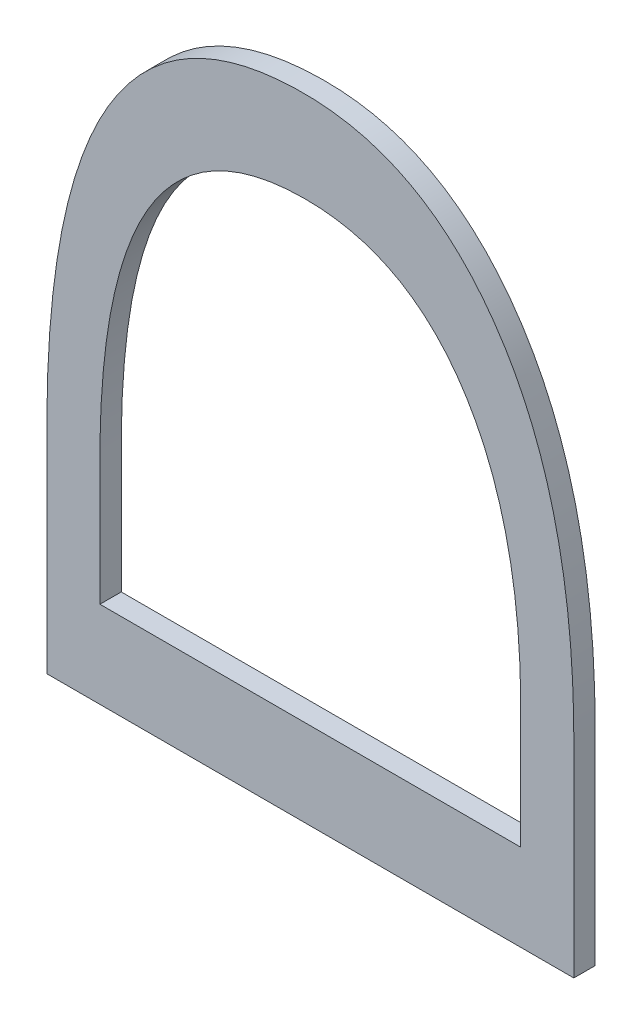
ISO-10303-21;
HEADER;
FILE_DESCRIPTION(('STEP AP214'),'2;1');
FILE_NAME('part.step','',(''),(''),'','','');
FILE_SCHEMA(('AUTOMOTIVE_DESIGN { 1 0 10303 214 1 1 1 1 }'));
ENDSEC;
DATA;
#1=APPLICATION_CONTEXT('core data for automotive mechanical design processes');
#2=APPLICATION_PROTOCOL_DEFINITION('international standard','automotive_design',2000,#1);
#3=PRODUCT_CONTEXT('',#1,'mechanical');
#4=PRODUCT('Part','Part','',(#3));
#5=PRODUCT_RELATED_PRODUCT_CATEGORY('part','',(#4));
#6=PRODUCT_DEFINITION_FORMATION('','',#4);
#7=PRODUCT_DEFINITION_CONTEXT('part definition',#1,'design');
#8=PRODUCT_DEFINITION('design','',#6,#7);
#9=PRODUCT_DEFINITION_SHAPE('','',#8);
#10=(LENGTH_UNIT() NAMED_UNIT(*) SI_UNIT(.MILLI.,.METRE.));
#11=(NAMED_UNIT(*) PLANE_ANGLE_UNIT() SI_UNIT($,.RADIAN.));
#12=(NAMED_UNIT(*) SI_UNIT($,.STERADIAN.) SOLID_ANGLE_UNIT());
#13=UNCERTAINTY_MEASURE_WITH_UNIT(LENGTH_MEASURE(1.E-05),#10,'distance_accuracy_value','');
#14=(GEOMETRIC_REPRESENTATION_CONTEXT(3) GLOBAL_UNCERTAINTY_ASSIGNED_CONTEXT((#13)) GLOBAL_UNIT_ASSIGNED_CONTEXT((#10,
#11,#12)) REPRESENTATION_CONTEXT('',''));
#15=CARTESIAN_POINT('',(0.,0.,0.));
#16=DIRECTION('',(0.,0.,1.));
#17=DIRECTION('',(1.,0.,0.));
#18=AXIS2_PLACEMENT_3D('',#15,#16,#17);
#19=CARTESIAN_POINT('',(-8.95983005625009,-22.7704584365744,333.160489148867));
#20=DIRECTION('',(0.,0.,1.));
#21=DIRECTION('',(1.,0.,0.));
#22=AXIS2_PLACEMENT_3D('',#19,#20,#21);
#23=PLANE('',#22);
#24=CARTESIAN_POINT('',(-13.8325482804087,-44.3320507494548,333.160489148867));
#25=CARTESIAN_POINT('',(-13.8325482804087,-43.3263791281688,333.160489148867));
#26=CARTESIAN_POINT('',(-13.8325482804087,-42.3207075068828,333.160489148867));
#27=CARTESIAN_POINT('',(-13.8325482804087,-37.4024948968582,333.160489148867));
#28=CARTESIAN_POINT('',(-12.6273384456497,-35.4462240517384,333.160489148867));
#29=CARTESIAN_POINT('',(-9.061195241034,-35.4462240517384,333.160489148867));
#30=CARTESIAN_POINT('',(-8.1385310894113,-35.9730048119212,333.160489148867));
#31=CARTESIAN_POINT('',(-6.7593248729568,-38.0801261686606,333.160489148867));
#32=CARTESIAN_POINT('',(-6.41452319026449,-39.5479279632996,333.160489148867));
#33=CARTESIAN_POINT('',(-6.41452319026449,-42.3973301965701,333.160489148867));
#34=CARTESIAN_POINT('',(-6.41452319026449,-43.3646904730125,333.160489148867));
#35=CARTESIAN_POINT('',(-6.41452319026449,-44.3320507494548,333.160489148867));
#36=(BOUNDED_CURVE() B_SPLINE_CURVE(3,(#24,#25,#26,#27,#28,#29,#30,#31,#32,#33,#34,#35),
.UNSPECIFIED.,.F.,.F.) B_SPLINE_CURVE_WITH_KNOTS((4,2,2,2,2,4),(0.,0.104384105417481,
0.510487929344108,0.705202651644714,0.899917519166078,1.),
.UNSPECIFIED.) CURVE() GEOMETRIC_REPRESENTATION_ITEM() RATIONAL_B_SPLINE_CURVE((1.,1.,1.,1.,1.,
1.,1.,1.,1.,1.,1.,1.)) REPRESENTATION_ITEM(''));
#37=CARTESIAN_POINT('',(-13.8325482804087,-44.3320507494548,333.160489148867));
#38=VERTEX_POINT('',#37);
#39=CARTESIAN_POINT('',(-6.41452319026449,-44.3320507494548,333.160489148867));
#40=VERTEX_POINT('',#39);
#41=EDGE_CURVE('E11',#38,#40,#36,.T.);
#42=ORIENTED_EDGE('',*,*,#41,.T.);
#43=DIRECTION('',(-1.,0.,0.));
#44=VECTOR('',#43,1.);
#45=CARTESIAN_POINT('',(2.66453525910038E-13,-44.3320507494548,333.160489148867));
#46=LINE('',#45,#44);
#47=EDGE_CURVE('E120',#40,#38,#46,.T.);
#48=ORIENTED_EDGE('',*,*,#47,.T.);
#49=EDGE_LOOP('',(#42,#48));
#50=FACE_BOUND('',#49,.T.);
#51=CARTESIAN_POINT('',(-7.16159350276449,-43.1108781232529,333.160489148867));
#52=CARTESIAN_POINT('',(-7.16159350276449,-42.5457864766182,333.160489148867));
#53=CARTESIAN_POINT('',(-7.16159350276449,-41.9806948299836,333.160489148867));
#54=CARTESIAN_POINT('',(-7.16159350276449,-39.9358292951279,333.160489148867));
#55=CARTESIAN_POINT('',(-7.42657987323588,-38.7840963618851,333.160489148867));
#56=CARTESIAN_POINT('',(-8.48652576988016,-37.1367102664495,333.160489148867));
#57=CARTESIAN_POINT('',(-9.23199965358236,-36.7248636250557,333.160489148867));
#58=CARTESIAN_POINT('',(-12.1213101749282,-36.7248636250557,333.160489148867));
#59=CARTESIAN_POINT('',(-13.0854779679087,-38.264499103589,333.160489148867));
#60=CARTESIAN_POINT('',(-13.0854779679087,-41.932805613854,333.160489148867));
#61=CARTESIAN_POINT('',(-13.0854779679087,-42.5218418685534,333.160489148867));
#62=CARTESIAN_POINT('',(-13.0854779679087,-43.1108781232529,333.160489148867));
#63=(BOUNDED_CURVE() B_SPLINE_CURVE(3,(#51,#52,#53,#54,#55,#56,#57,#58,#59,#60,#61,#62),
.UNSPECIFIED.,.F.,.F.) B_SPLINE_CURVE_WITH_KNOTS((4,2,2,2,2,4),(0.,0.0800183044780574,
0.289557762814667,0.499097055222359,0.919567791368009,1.),
.UNSPECIFIED.) CURVE() GEOMETRIC_REPRESENTATION_ITEM() RATIONAL_B_SPLINE_CURVE((1.,1.,1.,1.,1.,
1.,1.,1.,1.,1.,1.,1.)) REPRESENTATION_ITEM(''));
#64=CARTESIAN_POINT('',(-7.16159350276449,-43.1108781232529,333.160489148867));
#65=VERTEX_POINT('',#64);
#66=CARTESIAN_POINT('',(-13.0854779679087,-43.1108781232529,333.160489148867));
#67=VERTEX_POINT('',#66);
#68=EDGE_CURVE('E89',#65,#67,#63,.T.);
#69=ORIENTED_EDGE('',*,*,#68,.T.);
#70=DIRECTION('',(1.,0.,0.));
#71=VECTOR('',#70,1.);
#72=CARTESIAN_POINT('',(2.66453525910038E-13,-43.1108781232529,333.160489148867));
#73=LINE('',#72,#71);
#74=EDGE_CURVE('E101',#67,#65,#73,.T.);
#75=ORIENTED_EDGE('',*,*,#74,.T.);
#76=EDGE_LOOP('',(#69,#75));
#77=FACE_BOUND('',#76,.T.);
#78=ADVANCED_FACE('F43',(#50,#77),#23,.F.);
#79=CARTESIAN_POINT('',(-13.8325482804087,-44.3320507494548,332.960489148867));
#80=CARTESIAN_POINT('',(-13.8325482804087,-43.3263791281688,332.960489148867));
#81=CARTESIAN_POINT('',(-13.8325482804087,-42.3207075068828,332.960489148867));
#82=CARTESIAN_POINT('',(-13.8325482804087,-37.4024948968582,332.960489148867));
#83=CARTESIAN_POINT('',(-12.6273384456497,-35.4462240517384,332.960489148867));
#84=CARTESIAN_POINT('',(-9.061195241034,-35.4462240517384,332.960489148867));
#85=CARTESIAN_POINT('',(-8.1385310894113,-35.9730048119212,332.960489148867));
#86=CARTESIAN_POINT('',(-6.7593248729568,-38.0801261686606,332.960489148867));
#87=CARTESIAN_POINT('',(-6.41452319026449,-39.5479279632996,332.960489148867));
#88=CARTESIAN_POINT('',(-6.41452319026449,-42.3973301965701,332.960489148867));
#89=CARTESIAN_POINT('',(-6.41452319026449,-43.3646904730125,332.960489148867));
#90=CARTESIAN_POINT('',(-6.41452319026449,-44.3320507494548,332.960489148867));
#91=(BOUNDED_CURVE() B_SPLINE_CURVE(3,(#79,#80,#81,#82,#83,#84,#85,#86,#87,#88,#89,#90),
.UNSPECIFIED.,.F.,.F.) B_SPLINE_CURVE_WITH_KNOTS((4,2,2,2,2,4),(0.,0.104384105417481,
0.510487929344108,0.705202651644714,0.899917519166078,1.),
.UNSPECIFIED.) CURVE() GEOMETRIC_REPRESENTATION_ITEM() RATIONAL_B_SPLINE_CURVE((1.,1.,1.,1.,1.,
1.,1.,1.,1.,1.,1.,1.)) REPRESENTATION_ITEM(''));
#92=DIRECTION('',(0.,0.,1.));
#93=VECTOR('',#92,1.);
#94=SURFACE_OF_LINEAR_EXTRUSION('',#91,#93);
#95=ORIENTED_EDGE('',*,*,#41,.F.);
#96=CARTESIAN_POINT('',(-13.8325482804087,-44.3320507494548,333.160489148867));
#97=CARTESIAN_POINT('',(-13.8325482804087,-44.3320507494548,333.460489148867));
#98=(BOUNDED_CURVE() B_SPLINE_CURVE(1,(#96,#97),.UNSPECIFIED.,.F.,
.F.) B_SPLINE_CURVE_WITH_KNOTS((2,2),(0.,1.),
.UNSPECIFIED.) CURVE() GEOMETRIC_REPRESENTATION_ITEM() RATIONAL_B_SPLINE_CURVE((1.,1.)) REPRESENTATION_ITEM(''));
#99=CARTESIAN_POINT('',(-13.8325482804087,-44.3320507494548,333.460489148867));
#100=VERTEX_POINT('',#99);
#101=EDGE_CURVE('E55',#38,#100,#98,.T.);
#102=ORIENTED_EDGE('',*,*,#101,.T.);
#103=CARTESIAN_POINT('',(-6.41452319026449,-44.3320507494548,333.460489148867));
#104=CARTESIAN_POINT('',(-6.41452319026449,-43.3646904730125,333.460489148867));
#105=CARTESIAN_POINT('',(-6.41452319026449,-42.3973301965701,333.460489148867));
#106=CARTESIAN_POINT('',(-6.41452319026449,-39.5479279632996,333.460489148867));
#107=CARTESIAN_POINT('',(-6.7593248729568,-38.0801261686606,333.460489148867));
#108=CARTESIAN_POINT('',(-8.1385310894113,-35.9730048119212,333.460489148867));
#109=CARTESIAN_POINT('',(-9.061195241034,-35.4462240517384,333.460489148867));
#110=CARTESIAN_POINT('',(-12.6273384456497,-35.4462240517384,333.460489148867));
#111=CARTESIAN_POINT('',(-13.8325482804087,-37.4024948968582,333.460489148867));
#112=CARTESIAN_POINT('',(-13.8325482804087,-42.3207075068828,333.460489148867));
#113=CARTESIAN_POINT('',(-13.8325482804087,-43.3263791281688,333.460489148867));
#114=CARTESIAN_POINT('',(-13.8325482804087,-44.3320507494548,333.460489148867));
#115=(BOUNDED_CURVE() B_SPLINE_CURVE(3,(#103,#104,#105,#106,#107,#108,#109,#110,#111,#112,#113,
#114),.UNSPECIFIED.,.F.,.F.) B_SPLINE_CURVE_WITH_KNOTS((4,2,2,2,2,4),(0.,0.100082480833922,
0.294797348355286,0.489512070655892,0.895615894582519,1.),
.UNSPECIFIED.) CURVE() GEOMETRIC_REPRESENTATION_ITEM() RATIONAL_B_SPLINE_CURVE((1.,1.,1.,1.,1.,
1.,1.,1.,1.,1.,1.,1.)) REPRESENTATION_ITEM(''));
#116=CARTESIAN_POINT('',(-6.41452319026449,-44.3320507494548,333.460489148867));
#117=VERTEX_POINT('',#116);
#118=EDGE_CURVE('E107',#117,#100,#115,.T.);
#119=ORIENTED_EDGE('',*,*,#118,.F.);
#120=CARTESIAN_POINT('',(-6.41452319026449,-44.3320507494548,333.460489148867));
#121=CARTESIAN_POINT('',(-6.41452319026449,-44.3320507494548,333.160489148867));
#122=(BOUNDED_CURVE() B_SPLINE_CURVE(1,(#120,#121),.UNSPECIFIED.,.F.,
.F.) B_SPLINE_CURVE_WITH_KNOTS((2,2),(0.,1.),
.UNSPECIFIED.) CURVE() GEOMETRIC_REPRESENTATION_ITEM() RATIONAL_B_SPLINE_CURVE((1.,1.)) REPRESENTATION_ITEM(''));
#123=EDGE_CURVE('E77',#117,#40,#122,.T.);
#124=ORIENTED_EDGE('',*,*,#123,.T.);
#125=EDGE_LOOP('',(#95,#102,#119,#124));
#126=FACE_BOUND('',#125,.T.);
#127=ADVANCED_FACE('F174',(#126),#94,.F.);
#128=CARTESIAN_POINT('',(-13.8325482804087,-44.3320507494548,332.960489148867));
#129=DIRECTION('',(0.,-1.,0.));
#130=DIRECTION('',(0.,0.,-1.));
#131=AXIS2_PLACEMENT_3D('',#128,#129,#130);
#132=PLANE('',#131);
#133=ORIENTED_EDGE('',*,*,#47,.F.);
#134=ORIENTED_EDGE('',*,*,#123,.F.);
#135=CARTESIAN_POINT('',(-13.8325482804087,-44.3320507494548,333.460489148867));
#136=CARTESIAN_POINT('',(-11.3598732503606,-44.3320507494548,333.460489148867));
#137=CARTESIAN_POINT('',(-8.88719822031257,-44.3320507494548,333.460489148867));
#138=CARTESIAN_POINT('',(-6.41452319026449,-44.3320507494548,333.460489148867));
#139=(BOUNDED_CURVE() B_SPLINE_CURVE(3,(#135,#136,#137,#138),.UNSPECIFIED.,.F.,
.F.) B_SPLINE_CURVE_WITH_KNOTS((4,4),(0.,1.),
.UNSPECIFIED.) CURVE() GEOMETRIC_REPRESENTATION_ITEM() RATIONAL_B_SPLINE_CURVE((1.,1.,1.,1.)) REPRESENTATION_ITEM(''));
#140=EDGE_CURVE('E117',#100,#117,#139,.T.);
#141=ORIENTED_EDGE('',*,*,#140,.F.);
#142=ORIENTED_EDGE('',*,*,#101,.F.);
#143=EDGE_LOOP('',(#133,#134,#141,#142));
#144=FACE_BOUND('',#143,.T.);
#145=ADVANCED_FACE('F167',(#144),#132,.T.);
#146=CARTESIAN_POINT('',(-10.401260528621,-35.4501383650431,333.460489148867));
#147=DIRECTION('',(0.,0.,-1.));
#148=DIRECTION('',(0.,-1.,0.));
#149=AXIS2_PLACEMENT_3D('',#146,#147,#148);
#150=PLANE('',#149);
#151=ORIENTED_EDGE('',*,*,#118,.T.);
#152=ORIENTED_EDGE('',*,*,#140,.T.);
#153=EDGE_LOOP('',(#151,#152));
#154=FACE_BOUND('',#153,.T.);
#155=CARTESIAN_POINT('',(-7.16159350276449,-43.1108781232529,333.460489148867));
#156=CARTESIAN_POINT('',(-9.13622165781257,-43.1108781232529,333.460489148867));
#157=CARTESIAN_POINT('',(-11.1108498128606,-43.1108781232529,333.460489148867));
#158=CARTESIAN_POINT('',(-13.0854779679087,-43.1108781232529,333.460489148867));
#159=(BOUNDED_CURVE() B_SPLINE_CURVE(3,(#155,#156,#157,#158),.UNSPECIFIED.,.F.,
.F.) B_SPLINE_CURVE_WITH_KNOTS((4,4),(0.,1.),
.UNSPECIFIED.) CURVE() GEOMETRIC_REPRESENTATION_ITEM() RATIONAL_B_SPLINE_CURVE((1.,1.,1.,1.)) REPRESENTATION_ITEM(''));
#160=CARTESIAN_POINT('',(-7.16159350276449,-43.1108781232529,333.460489148867));
#161=VERTEX_POINT('',#160);
#162=CARTESIAN_POINT('',(-13.0854779679087,-43.1108781232529,333.460489148867));
#163=VERTEX_POINT('',#162);
#164=EDGE_CURVE('E102',#161,#163,#159,.T.);
#165=ORIENTED_EDGE('',*,*,#164,.T.);
#166=CARTESIAN_POINT('',(-13.0854779679087,-43.1108781232529,333.460489148867));
#167=CARTESIAN_POINT('',(-13.0854779679087,-42.5218418685534,333.460489148867));
#168=CARTESIAN_POINT('',(-13.0854779679087,-41.932805613854,333.460489148867));
#169=CARTESIAN_POINT('',(-13.0854779679087,-38.264499103589,333.460489148867));
#170=CARTESIAN_POINT('',(-12.1213101749282,-36.7248636250557,333.460489148867));
#171=CARTESIAN_POINT('',(-9.23199965358236,-36.7248636250557,333.460489148867));
#172=CARTESIAN_POINT('',(-8.48652576988016,-37.1367102664495,333.460489148867));
#173=CARTESIAN_POINT('',(-7.42657987323588,-38.7840963618851,333.460489148867));
#174=CARTESIAN_POINT('',(-7.16159350276449,-39.9358292951279,333.460489148867));
#175=CARTESIAN_POINT('',(-7.16159350276449,-41.9806948299836,333.460489148867));
#176=CARTESIAN_POINT('',(-7.16159350276449,-42.5457864766182,333.460489148867));
#177=CARTESIAN_POINT('',(-7.16159350276449,-43.1108781232529,333.460489148867));
#178=(BOUNDED_CURVE() B_SPLINE_CURVE(3,(#166,#167,#168,#169,#170,#171,#172,#173,#174,#175,#176,
#177),.UNSPECIFIED.,.F.,.F.) B_SPLINE_CURVE_WITH_KNOTS((4,2,2,2,2,4),(0.,0.0804322086319911,
0.500902944777641,0.710442237185333,0.919981695521943,1.),
.UNSPECIFIED.) CURVE() GEOMETRIC_REPRESENTATION_ITEM() RATIONAL_B_SPLINE_CURVE((1.,1.,1.,1.,1.,
1.,1.,1.,1.,1.,1.,1.)) REPRESENTATION_ITEM(''));
#179=EDGE_CURVE('E83',#163,#161,#178,.T.);
#180=ORIENTED_EDGE('',*,*,#179,.T.);
#181=EDGE_LOOP('',(#165,#180));
#182=FACE_BOUND('',#181,.T.);
#183=ADVANCED_FACE('F165',(#154,#182),#150,.F.);
#184=CARTESIAN_POINT('',(-7.16159350276449,-43.1108781232529,332.960489148867));
#185=CARTESIAN_POINT('',(-7.16159350276449,-42.5457864766182,332.960489148867));
#186=CARTESIAN_POINT('',(-7.16159350276449,-41.9806948299836,332.960489148867));
#187=CARTESIAN_POINT('',(-7.16159350276449,-39.9358292951279,332.960489148867));
#188=CARTESIAN_POINT('',(-7.42657987323588,-38.7840963618851,332.960489148867));
#189=CARTESIAN_POINT('',(-8.48652576988016,-37.1367102664495,332.960489148867));
#190=CARTESIAN_POINT('',(-9.23199965358236,-36.7248636250557,332.960489148867));
#191=CARTESIAN_POINT('',(-12.1213101749282,-36.7248636250557,332.960489148867));
#192=CARTESIAN_POINT('',(-13.0854779679087,-38.264499103589,332.960489148867));
#193=CARTESIAN_POINT('',(-13.0854779679087,-41.932805613854,332.960489148867));
#194=CARTESIAN_POINT('',(-13.0854779679087,-42.5218418685534,332.960489148867));
#195=CARTESIAN_POINT('',(-13.0854779679087,-43.1108781232529,332.960489148867));
#196=(BOUNDED_CURVE() B_SPLINE_CURVE(3,(#184,#185,#186,#187,#188,#189,#190,#191,#192,#193,#194,
#195),.UNSPECIFIED.,.F.,.F.) B_SPLINE_CURVE_WITH_KNOTS((4,2,2,2,2,4),(0.,0.0800183044780574,
0.289557762814667,0.499097055222359,0.919567791368009,1.),
.UNSPECIFIED.) CURVE() GEOMETRIC_REPRESENTATION_ITEM() RATIONAL_B_SPLINE_CURVE((1.,1.,1.,1.,1.,
1.,1.,1.,1.,1.,1.,1.)) REPRESENTATION_ITEM(''));
#197=DIRECTION('',(0.,0.,1.));
#198=VECTOR('',#197,1.);
#199=SURFACE_OF_LINEAR_EXTRUSION('',#196,#198);
#200=ORIENTED_EDGE('',*,*,#68,.F.);
#201=CARTESIAN_POINT('',(-7.16159350276449,-43.1108781232529,333.460489148867));
#202=CARTESIAN_POINT('',(-7.16159350276449,-43.1108781232529,333.360489148867));
#203=CARTESIAN_POINT('',(-7.16159350276449,-43.1108781232529,333.260489148867));
#204=CARTESIAN_POINT('',(-7.16159350276449,-43.1108781232529,333.160489148867));
#205=(BOUNDED_CURVE() B_SPLINE_CURVE(3,(#201,#202,#203,#204),.UNSPECIFIED.,.F.,
.F.) B_SPLINE_CURVE_WITH_KNOTS((4,4),(0.,1.),
.UNSPECIFIED.) CURVE() GEOMETRIC_REPRESENTATION_ITEM() RATIONAL_B_SPLINE_CURVE((1.,1.,1.,1.)) REPRESENTATION_ITEM(''));
#206=EDGE_CURVE('E91',#161,#65,#205,.T.);
#207=ORIENTED_EDGE('',*,*,#206,.F.);
#208=ORIENTED_EDGE('',*,*,#179,.F.);
#209=CARTESIAN_POINT('',(-13.0854779679087,-43.1108781232529,333.160489148867));
#210=CARTESIAN_POINT('',(-13.0854779679087,-43.1108781232529,333.260489148867));
#211=CARTESIAN_POINT('',(-13.0854779679087,-43.1108781232529,333.360489148867));
#212=CARTESIAN_POINT('',(-13.0854779679087,-43.1108781232529,333.460489148867));
#213=(BOUNDED_CURVE() B_SPLINE_CURVE(3,(#209,#210,#211,#212),.UNSPECIFIED.,.F.,
.F.) B_SPLINE_CURVE_WITH_KNOTS((4,4),(0.,1.),
.UNSPECIFIED.) CURVE() GEOMETRIC_REPRESENTATION_ITEM() RATIONAL_B_SPLINE_CURVE((1.,1.,1.,1.)) REPRESENTATION_ITEM(''));
#214=EDGE_CURVE('E94',#67,#163,#213,.T.);
#215=ORIENTED_EDGE('',*,*,#214,.F.);
#216=EDGE_LOOP('',(#200,#207,#208,#215));
#217=FACE_BOUND('',#216,.T.);
#218=ADVANCED_FACE('F45',(#217),#199,.F.);
#219=CARTESIAN_POINT('',(-7.16159350276449,-43.1108781232529,332.960489148867));
#220=DIRECTION('',(0.,1.,0.));
#221=DIRECTION('',(1.,0.,0.));
#222=AXIS2_PLACEMENT_3D('',#219,#220,#221);
#223=PLANE('',#222);
#224=ORIENTED_EDGE('',*,*,#74,.F.);
#225=ORIENTED_EDGE('',*,*,#214,.T.);
#226=ORIENTED_EDGE('',*,*,#164,.F.);
#227=ORIENTED_EDGE('',*,*,#206,.T.);
#228=EDGE_LOOP('',(#224,#225,#226,#227));
#229=FACE_BOUND('',#228,.T.);
#230=ADVANCED_FACE('F100',(#229),#223,.T.);
#231=CLOSED_SHELL('',(#78,#127,#145,#183,#218,#230));
#232=MANIFOLD_SOLID_BREP('B2',#231);
#233=ADVANCED_BREP_SHAPE_REPRESENTATION('',(#18,#232),#14);
#234=SHAPE_DEFINITION_REPRESENTATION(#9,#233);
ENDSEC;
END-ISO-10303-21;
